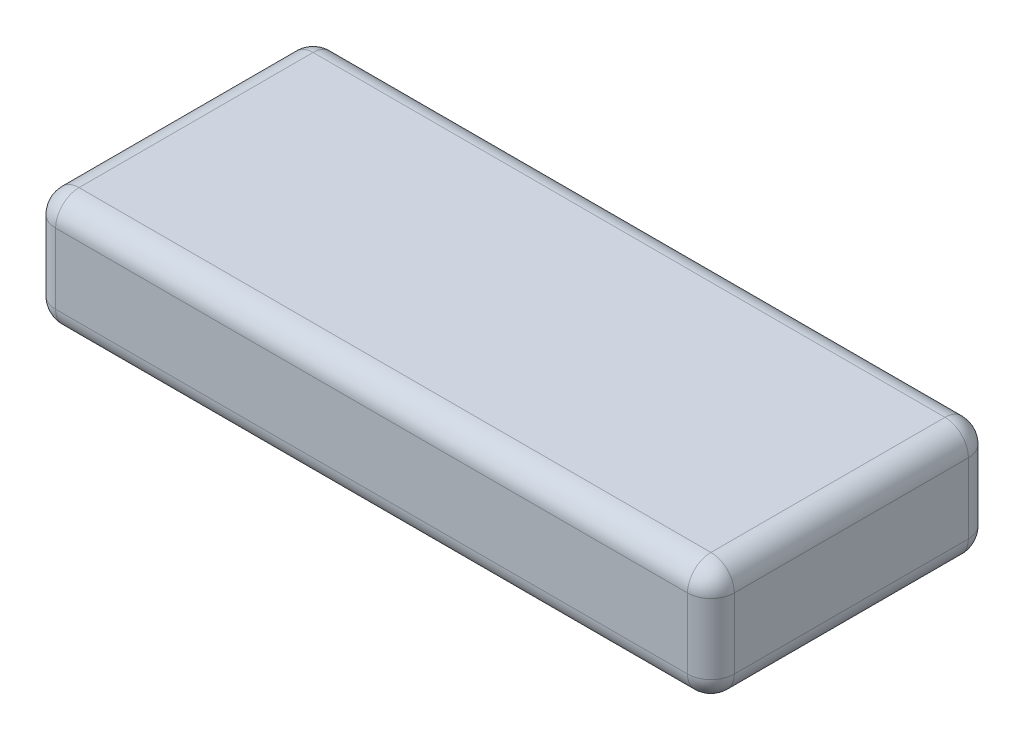
ISO-10303-21;
HEADER;
FILE_DESCRIPTION(('STEP AP214'),'2;1');
FILE_NAME('part.step','',(''),(''),'','','');
FILE_SCHEMA(('AUTOMOTIVE_DESIGN { 1 0 10303 214 1 1 1 1 }'));
ENDSEC;
DATA;
#1=APPLICATION_CONTEXT('core data for automotive mechanical design processes');
#2=APPLICATION_PROTOCOL_DEFINITION('international standard','automotive_design',2000,#1);
#3=PRODUCT_CONTEXT('',#1,'mechanical');
#4=PRODUCT('Part','Part','',(#3));
#5=PRODUCT_RELATED_PRODUCT_CATEGORY('part','',(#4));
#6=PRODUCT_DEFINITION_FORMATION('','',#4);
#7=PRODUCT_DEFINITION_CONTEXT('part definition',#1,'design');
#8=PRODUCT_DEFINITION('design','',#6,#7);
#9=PRODUCT_DEFINITION_SHAPE('','',#8);
#10=(LENGTH_UNIT() NAMED_UNIT(*) SI_UNIT(.MILLI.,.METRE.));
#11=(NAMED_UNIT(*) PLANE_ANGLE_UNIT() SI_UNIT($,.RADIAN.));
#12=(NAMED_UNIT(*) SI_UNIT($,.STERADIAN.) SOLID_ANGLE_UNIT());
#13=UNCERTAINTY_MEASURE_WITH_UNIT(LENGTH_MEASURE(1.E-05),#10,'distance_accuracy_value','');
#14=(GEOMETRIC_REPRESENTATION_CONTEXT(3) GLOBAL_UNCERTAINTY_ASSIGNED_CONTEXT((#13)) GLOBAL_UNIT_ASSIGNED_CONTEXT((#10,
#11,#12)) REPRESENTATION_CONTEXT('',''));
#15=CARTESIAN_POINT('',(0.,0.,0.));
#16=DIRECTION('',(0.,0.,1.));
#17=DIRECTION('',(1.,0.,0.));
#18=AXIS2_PLACEMENT_3D('',#15,#16,#17);
#19=CARTESIAN_POINT('',(14.5,5.,6.));
#20=DIRECTION('',(-1.,0.,0.));
#21=DIRECTION('',(0.,0.,1.));
#22=AXIS2_PLACEMENT_3D('',#19,#20,#21);
#23=PLANE('',#22);
#24=DIRECTION('',(0.,-1.,0.));
#25=VECTOR('',#24,1.);
#26=CARTESIAN_POINT('',(14.5,5.,5.));
#27=LINE('',#26,#25);
#28=CARTESIAN_POINT('',(14.5,4.,5.));
#29=VERTEX_POINT('',#28);
#30=CARTESIAN_POINT('',(14.5,1.,5.));
#31=VERTEX_POINT('',#30);
#32=EDGE_CURVE('E214',#29,#31,#27,.T.);
#33=ORIENTED_EDGE('',*,*,#32,.T.);
#34=DIRECTION('',(0.,0.,-1.));
#35=VECTOR('',#34,1.);
#36=CARTESIAN_POINT('',(14.5,1.,-6.));
#37=LINE('',#36,#35);
#38=CARTESIAN_POINT('',(14.5,1.,-5.));
#39=VERTEX_POINT('',#38);
#40=EDGE_CURVE('E218',#31,#39,#37,.T.);
#41=ORIENTED_EDGE('',*,*,#40,.T.);
#42=DIRECTION('',(0.,-1.,0.));
#43=VECTOR('',#42,1.);
#44=CARTESIAN_POINT('',(14.5,5.,-5.));
#45=LINE('',#44,#43);
#46=CARTESIAN_POINT('',(14.5,4.,-5.));
#47=VERTEX_POINT('',#46);
#48=EDGE_CURVE('E211',#39,#47,#45,.F.);
#49=ORIENTED_EDGE('',*,*,#48,.T.);
#50=DIRECTION('',(0.,0.,-1.));
#51=VECTOR('',#50,1.);
#52=CARTESIAN_POINT('',(14.5,4.,6.));
#53=LINE('',#52,#51);
#54=EDGE_CURVE('E208',#47,#29,#53,.F.);
#55=ORIENTED_EDGE('',*,*,#54,.T.);
#56=EDGE_LOOP('',(#33,#41,#49,#55));
#57=FACE_BOUND('',#56,.T.);
#58=ADVANCED_FACE('F45',(#57),#23,.F.);
#59=CARTESIAN_POINT('',(-14.5,5.,-6.));
#60=DIRECTION('',(0.,0.,1.));
#61=DIRECTION('',(1.,0.,0.));
#62=AXIS2_PLACEMENT_3D('',#59,#60,#61);
#63=PLANE('',#62);
#64=DIRECTION('',(0.,-1.,0.));
#65=VECTOR('',#64,1.);
#66=CARTESIAN_POINT('',(13.5,5.,-6.));
#67=LINE('',#66,#65);
#68=CARTESIAN_POINT('',(13.5,4.,-6.));
#69=VERTEX_POINT('',#68);
#70=CARTESIAN_POINT('',(13.5,1.,-6.));
#71=VERTEX_POINT('',#70);
#72=EDGE_CURVE('E187',#69,#71,#67,.T.);
#73=ORIENTED_EDGE('',*,*,#72,.T.);
#74=DIRECTION('',(-1.,0.,0.));
#75=VECTOR('',#74,1.);
#76=CARTESIAN_POINT('',(-14.5,1.,-6.));
#77=LINE('',#76,#75);
#78=CARTESIAN_POINT('',(-13.5,1.,-6.));
#79=VERTEX_POINT('',#78);
#80=EDGE_CURVE('E194',#71,#79,#77,.T.);
#81=ORIENTED_EDGE('',*,*,#80,.T.);
#82=DIRECTION('',(0.,-1.,0.));
#83=VECTOR('',#82,1.);
#84=CARTESIAN_POINT('',(-13.5,5.,-6.));
#85=LINE('',#84,#83);
#86=CARTESIAN_POINT('',(-13.5,4.,-6.));
#87=VERTEX_POINT('',#86);
#88=EDGE_CURVE('E190',#79,#87,#85,.F.);
#89=ORIENTED_EDGE('',*,*,#88,.T.);
#90=DIRECTION('',(-1.,0.,0.));
#91=VECTOR('',#90,1.);
#92=CARTESIAN_POINT('',(-14.5,4.,-6.));
#93=LINE('',#92,#91);
#94=EDGE_CURVE('E184',#87,#69,#93,.F.);
#95=ORIENTED_EDGE('',*,*,#94,.T.);
#96=EDGE_LOOP('',(#73,#81,#89,#95));
#97=FACE_BOUND('',#96,.T.);
#98=ADVANCED_FACE('F365',(#97),#63,.F.);
#99=CARTESIAN_POINT('',(-14.5,5.,6.));
#100=DIRECTION('',(1.,0.,0.));
#101=DIRECTION('',(0.,0.,-1.));
#102=AXIS2_PLACEMENT_3D('',#99,#100,#101);
#103=PLANE('',#102);
#104=DIRECTION('',(0.,-1.,0.));
#105=VECTOR('',#104,1.);
#106=CARTESIAN_POINT('',(-14.5,5.,-5.));
#107=LINE('',#106,#105);
#108=CARTESIAN_POINT('',(-14.5,4.,-5.));
#109=VERTEX_POINT('',#108);
#110=CARTESIAN_POINT('',(-14.5,1.,-5.));
#111=VERTEX_POINT('',#110);
#112=EDGE_CURVE('E146',#109,#111,#107,.T.);
#113=ORIENTED_EDGE('',*,*,#112,.T.);
#114=DIRECTION('',(0.,0.,1.));
#115=VECTOR('',#114,1.);
#116=CARTESIAN_POINT('',(-14.5,1.,6.));
#117=LINE('',#116,#115);
#118=CARTESIAN_POINT('',(-14.5,1.,5.));
#119=VERTEX_POINT('',#118);
#120=EDGE_CURVE('E141',#111,#119,#117,.T.);
#121=ORIENTED_EDGE('',*,*,#120,.T.);
#122=DIRECTION('',(0.,-1.,0.));
#123=VECTOR('',#122,1.);
#124=CARTESIAN_POINT('',(-14.5,5.,5.));
#125=LINE('',#124,#123);
#126=CARTESIAN_POINT('',(-14.5,4.,5.));
#127=VERTEX_POINT('',#126);
#128=EDGE_CURVE('E133',#119,#127,#125,.F.);
#129=ORIENTED_EDGE('',*,*,#128,.T.);
#130=DIRECTION('',(0.,0.,1.));
#131=VECTOR('',#130,1.);
#132=CARTESIAN_POINT('',(-14.5,4.,6.));
#133=LINE('',#132,#131);
#134=EDGE_CURVE('E138',#127,#109,#133,.F.);
#135=ORIENTED_EDGE('',*,*,#134,.T.);
#136=EDGE_LOOP('',(#113,#121,#129,#135));
#137=FACE_BOUND('',#136,.T.);
#138=ADVANCED_FACE('F136',(#137),#103,.F.);
#139=CARTESIAN_POINT('',(-14.5,5.,6.));
#140=DIRECTION('',(0.,0.,-1.));
#141=DIRECTION('',(-1.,0.,0.));
#142=AXIS2_PLACEMENT_3D('',#139,#140,#141);
#143=PLANE('',#142);
#144=DIRECTION('',(0.,-1.,0.));
#145=VECTOR('',#144,1.);
#146=CARTESIAN_POINT('',(-13.5,5.,6.));
#147=LINE('',#146,#145);
#148=CARTESIAN_POINT('',(-13.5,4.,6.));
#149=VERTEX_POINT('',#148);
#150=CARTESIAN_POINT('',(-13.5,1.,6.));
#151=VERTEX_POINT('',#150);
#152=EDGE_CURVE('E154',#149,#151,#147,.T.);
#153=ORIENTED_EDGE('',*,*,#152,.T.);
#154=DIRECTION('',(1.,0.,0.));
#155=VECTOR('',#154,1.);
#156=CARTESIAN_POINT('',(14.5,1.,6.));
#157=LINE('',#156,#155);
#158=CARTESIAN_POINT('',(13.5,1.,6.));
#159=VERTEX_POINT('',#158);
#160=EDGE_CURVE('E205',#151,#159,#157,.T.);
#161=ORIENTED_EDGE('',*,*,#160,.T.);
#162=DIRECTION('',(0.,-1.,0.));
#163=VECTOR('',#162,1.);
#164=CARTESIAN_POINT('',(13.5,5.,6.));
#165=LINE('',#164,#163);
#166=CARTESIAN_POINT('',(13.5,4.,6.));
#167=VERTEX_POINT('',#166);
#168=EDGE_CURVE('E200',#159,#167,#165,.F.);
#169=ORIENTED_EDGE('',*,*,#168,.T.);
#170=DIRECTION('',(1.,0.,0.));
#171=VECTOR('',#170,1.);
#172=CARTESIAN_POINT('',(-14.5,4.,6.));
#173=LINE('',#172,#171);
#174=EDGE_CURVE('E197',#167,#149,#173,.F.);
#175=ORIENTED_EDGE('',*,*,#174,.T.);
#176=EDGE_LOOP('',(#153,#161,#169,#175));
#177=FACE_BOUND('',#176,.T.);
#178=ADVANCED_FACE('F356',(#177),#143,.F.);
#179=CARTESIAN_POINT('',(0.,5.,0.));
#180=DIRECTION('',(0.,-1.,0.));
#181=DIRECTION('',(0.,0.,-1.));
#182=AXIS2_PLACEMENT_3D('',#179,#180,#181);
#183=PLANE('',#182);
#184=DIRECTION('',(0.,0.,1.));
#185=VECTOR('',#184,1.);
#186=CARTESIAN_POINT('',(-13.5,5.,0.));
#187=LINE('',#186,#185);
#188=CARTESIAN_POINT('',(-13.5,5.,-5.));
#189=VERTEX_POINT('',#188);
#190=CARTESIAN_POINT('',(-13.5,5.,5.));
#191=VERTEX_POINT('',#190);
#192=EDGE_CURVE('E55',#189,#191,#187,.T.);
#193=ORIENTED_EDGE('',*,*,#192,.T.);
#194=DIRECTION('',(1.,0.,0.));
#195=VECTOR('',#194,1.);
#196=CARTESIAN_POINT('',(0.,5.,5.));
#197=LINE('',#196,#195);
#198=CARTESIAN_POINT('',(13.5,5.,5.));
#199=VERTEX_POINT('',#198);
#200=EDGE_CURVE('E11',#191,#199,#197,.T.);
#201=ORIENTED_EDGE('',*,*,#200,.T.);
#202=DIRECTION('',(0.,0.,-1.));
#203=VECTOR('',#202,1.);
#204=CARTESIAN_POINT('',(13.5,5.,0.));
#205=LINE('',#204,#203);
#206=CARTESIAN_POINT('',(13.5,5.,-5.));
#207=VERTEX_POINT('',#206);
#208=EDGE_CURVE('E234',#199,#207,#205,.T.);
#209=ORIENTED_EDGE('',*,*,#208,.T.);
#210=DIRECTION('',(-1.,0.,0.));
#211=VECTOR('',#210,1.);
#212=CARTESIAN_POINT('',(0.,5.,-5.));
#213=LINE('',#212,#211);
#214=EDGE_CURVE('E66',#207,#189,#213,.T.);
#215=ORIENTED_EDGE('',*,*,#214,.T.);
#216=EDGE_LOOP('',(#193,#201,#209,#215));
#217=FACE_BOUND('',#216,.T.);
#218=ADVANCED_FACE('F358',(#217),#183,.F.);
#219=CARTESIAN_POINT('',(0.,0.,0.));
#220=DIRECTION('',(0.,-1.,0.));
#221=DIRECTION('',(0.,0.,-1.));
#222=AXIS2_PLACEMENT_3D('',#219,#220,#221);
#223=PLANE('',#222);
#224=DIRECTION('',(0.,0.,1.));
#225=VECTOR('',#224,1.);
#226=CARTESIAN_POINT('',(-13.5,0.,-6.));
#227=LINE('',#226,#225);
#228=CARTESIAN_POINT('',(-13.5,0.,5.));
#229=VERTEX_POINT('',#228);
#230=CARTESIAN_POINT('',(-13.5,0.,-5.));
#231=VERTEX_POINT('',#230);
#232=EDGE_CURVE('E227',#229,#231,#227,.F.);
#233=ORIENTED_EDGE('',*,*,#232,.T.);
#234=DIRECTION('',(-1.,0.,0.));
#235=VECTOR('',#234,1.);
#236=CARTESIAN_POINT('',(14.5,0.,-5.));
#237=LINE('',#236,#235);
#238=CARTESIAN_POINT('',(13.5,0.,-5.));
#239=VERTEX_POINT('',#238);
#240=EDGE_CURVE('E230',#231,#239,#237,.F.);
#241=ORIENTED_EDGE('',*,*,#240,.T.);
#242=DIRECTION('',(0.,0.,-1.));
#243=VECTOR('',#242,1.);
#244=CARTESIAN_POINT('',(13.5,0.,6.));
#245=LINE('',#244,#243);
#246=CARTESIAN_POINT('',(13.5,0.,5.));
#247=VERTEX_POINT('',#246);
#248=EDGE_CURVE('E221',#239,#247,#245,.F.);
#249=ORIENTED_EDGE('',*,*,#248,.T.);
#250=DIRECTION('',(1.,0.,0.));
#251=VECTOR('',#250,1.);
#252=CARTESIAN_POINT('',(-14.5,0.,5.));
#253=LINE('',#252,#251);
#254=EDGE_CURVE('E224',#247,#229,#253,.F.);
#255=ORIENTED_EDGE('',*,*,#254,.T.);
#256=EDGE_LOOP('',(#233,#241,#249,#255));
#257=FACE_BOUND('',#256,.T.);
#258=ADVANCED_FACE('F325',(#257),#223,.T.);
#259=CARTESIAN_POINT('',(13.5,5.,5.));
#260=DIRECTION('',(0.,-1.,0.));
#261=DIRECTION('',(0.,0.,-1.));
#262=AXIS2_PLACEMENT_3D('',#259,#260,#261);
#263=CYLINDRICAL_SURFACE('',#262,1.);
#264=CARTESIAN_POINT('',(13.5,4.,5.));
#265=DIRECTION('',(0.,1.,0.));
#266=DIRECTION('',(0.,0.,1.));
#267=AXIS2_PLACEMENT_3D('',#264,#265,#266);
#268=CIRCLE('',#267,1.);
#269=EDGE_CURVE('E49',#167,#29,#268,.T.);
#270=ORIENTED_EDGE('',*,*,#269,.F.);
#271=ORIENTED_EDGE('',*,*,#168,.F.);
#272=CARTESIAN_POINT('',(13.5,1.,5.));
#273=DIRECTION('',(0.,-1.,0.));
#274=DIRECTION('',(0.,0.,-1.));
#275=AXIS2_PLACEMENT_3D('',#272,#273,#274);
#276=CIRCLE('',#275,1.);
#277=EDGE_CURVE('E178',#31,#159,#276,.T.);
#278=ORIENTED_EDGE('',*,*,#277,.F.);
#279=ORIENTED_EDGE('',*,*,#32,.F.);
#280=EDGE_LOOP('',(#270,#271,#278,#279));
#281=FACE_BOUND('',#280,.T.);
#282=ADVANCED_FACE('F47',(#281),#263,.T.);
#283=CARTESIAN_POINT('',(13.5,4.,5.));
#284=DIRECTION('',(1.,0.,0.));
#285=DIRECTION('',(0.,0.,-1.));
#286=AXIS2_PLACEMENT_3D('',#283,#284,#285);
#287=SPHERICAL_SURFACE('',#286,1.);
#288=CARTESIAN_POINT('',(13.5,4.,5.));
#289=DIRECTION('',(1.,0.,0.));
#290=DIRECTION('',(0.,0.,-1.));
#291=AXIS2_PLACEMENT_3D('',#288,#289,#290);
#292=CIRCLE('',#291,1.);
#293=EDGE_CURVE('E301',#167,#199,#292,.F.);
#294=ORIENTED_EDGE('',*,*,#293,.F.);
#295=ORIENTED_EDGE('',*,*,#269,.T.);
#296=CARTESIAN_POINT('',(13.5,4.,5.));
#297=DIRECTION('',(0.,0.,1.));
#298=DIRECTION('',(1.,0.,0.));
#299=AXIS2_PLACEMENT_3D('',#296,#297,#298);
#300=CIRCLE('',#299,1.);
#301=EDGE_CURVE('E305',#199,#29,#300,.F.);
#302=ORIENTED_EDGE('',*,*,#301,.F.);
#303=EDGE_LOOP('',(#294,#295,#302));
#304=FACE_BOUND('',#303,.T.);
#305=ADVANCED_FACE('F351',(#304),#287,.T.);
#306=CARTESIAN_POINT('',(13.5,1.,5.));
#307=DIRECTION('',(0.,0.,1.));
#308=DIRECTION('',(1.,0.,0.));
#309=AXIS2_PLACEMENT_3D('',#306,#307,#308);
#310=SPHERICAL_SURFACE('',#309,1.);
#311=CARTESIAN_POINT('',(13.5,1.,5.));
#312=DIRECTION('',(0.,0.,1.));
#313=DIRECTION('',(1.,0.,0.));
#314=AXIS2_PLACEMENT_3D('',#311,#312,#313);
#315=CIRCLE('',#314,1.);
#316=EDGE_CURVE('E293',#31,#247,#315,.F.);
#317=ORIENTED_EDGE('',*,*,#316,.F.);
#318=ORIENTED_EDGE('',*,*,#277,.T.);
#319=CARTESIAN_POINT('',(13.5,1.,5.));
#320=DIRECTION('',(1.,0.,0.));
#321=DIRECTION('',(0.,0.,-1.));
#322=AXIS2_PLACEMENT_3D('',#319,#320,#321);
#323=CIRCLE('',#322,1.);
#324=EDGE_CURVE('E297',#247,#159,#323,.F.);
#325=ORIENTED_EDGE('',*,*,#324,.F.);
#326=EDGE_LOOP('',(#317,#318,#325));
#327=FACE_BOUND('',#326,.T.);
#328=ADVANCED_FACE('F314',(#327),#310,.T.);
#329=CARTESIAN_POINT('',(13.5,4.,0.));
#330=DIRECTION('',(0.,0.,-1.));
#331=DIRECTION('',(-1.,0.,0.));
#332=AXIS2_PLACEMENT_3D('',#329,#330,#331);
#333=CYLINDRICAL_SURFACE('',#332,1.);
#334=ORIENTED_EDGE('',*,*,#301,.T.);
#335=ORIENTED_EDGE('',*,*,#54,.F.);
#336=CARTESIAN_POINT('',(13.5,4.,-5.));
#337=DIRECTION('',(0.,0.,-1.));
#338=DIRECTION('',(-1.,0.,0.));
#339=AXIS2_PLACEMENT_3D('',#336,#337,#338);
#340=CIRCLE('',#339,1.);
#341=EDGE_CURVE('E285',#207,#47,#340,.T.);
#342=ORIENTED_EDGE('',*,*,#341,.F.);
#343=ORIENTED_EDGE('',*,*,#208,.F.);
#344=EDGE_LOOP('',(#334,#335,#342,#343));
#345=FACE_BOUND('',#344,.T.);
#346=ADVANCED_FACE('F346',(#345),#333,.T.);
#347=CARTESIAN_POINT('',(0.,4.,5.));
#348=DIRECTION('',(1.,0.,0.));
#349=DIRECTION('',(0.,0.,-1.));
#350=AXIS2_PLACEMENT_3D('',#347,#348,#349);
#351=CYLINDRICAL_SURFACE('',#350,1.);
#352=ORIENTED_EDGE('',*,*,#293,.T.);
#353=ORIENTED_EDGE('',*,*,#200,.F.);
#354=CARTESIAN_POINT('',(-13.5,4.,5.));
#355=DIRECTION('',(-1.,0.,0.));
#356=DIRECTION('',(0.,0.,1.));
#357=AXIS2_PLACEMENT_3D('',#354,#355,#356);
#358=CIRCLE('',#357,1.);
#359=EDGE_CURVE('E159',#149,#191,#358,.T.);
#360=ORIENTED_EDGE('',*,*,#359,.F.);
#361=ORIENTED_EDGE('',*,*,#174,.F.);
#362=EDGE_LOOP('',(#352,#353,#360,#361));
#363=FACE_BOUND('',#362,.T.);
#364=ADVANCED_FACE('F354',(#363),#351,.T.);
#365=CARTESIAN_POINT('',(-13.5,5.,5.));
#366=DIRECTION('',(0.,-1.,0.));
#367=DIRECTION('',(0.,0.,-1.));
#368=AXIS2_PLACEMENT_3D('',#365,#366,#367);
#369=CYLINDRICAL_SURFACE('',#368,1.);
#370=CARTESIAN_POINT('',(-13.5,1.,5.));
#371=DIRECTION('',(0.,-1.,0.));
#372=DIRECTION('',(0.,0.,-1.));
#373=AXIS2_PLACEMENT_3D('',#370,#371,#372);
#374=CIRCLE('',#373,1.);
#375=EDGE_CURVE('E160',#151,#119,#374,.T.);
#376=ORIENTED_EDGE('',*,*,#375,.F.);
#377=ORIENTED_EDGE('',*,*,#152,.F.);
#378=CARTESIAN_POINT('',(-13.5,4.,5.));
#379=DIRECTION('',(0.,1.,0.));
#380=DIRECTION('',(0.,0.,1.));
#381=AXIS2_PLACEMENT_3D('',#378,#379,#380);
#382=CIRCLE('',#381,1.);
#383=EDGE_CURVE('E150',#127,#149,#382,.T.);
#384=ORIENTED_EDGE('',*,*,#383,.F.);
#385=ORIENTED_EDGE('',*,*,#128,.F.);
#386=EDGE_LOOP('',(#376,#377,#384,#385));
#387=FACE_BOUND('',#386,.T.);
#388=ADVANCED_FACE('F152',(#387),#369,.T.);
#389=CARTESIAN_POINT('',(-14.5,1.,5.));
#390=DIRECTION('',(-1.,0.,0.));
#391=DIRECTION('',(0.,0.,1.));
#392=AXIS2_PLACEMENT_3D('',#389,#390,#391);
#393=CYLINDRICAL_SURFACE('',#392,1.);
#394=ORIENTED_EDGE('',*,*,#324,.T.);
#395=ORIENTED_EDGE('',*,*,#160,.F.);
#396=CARTESIAN_POINT('',(-13.5,1.,5.));
#397=DIRECTION('',(-1.,0.,0.));
#398=DIRECTION('',(0.,0.,1.));
#399=AXIS2_PLACEMENT_3D('',#396,#397,#398);
#400=CIRCLE('',#399,1.);
#401=EDGE_CURVE('E278',#229,#151,#400,.T.);
#402=ORIENTED_EDGE('',*,*,#401,.F.);
#403=ORIENTED_EDGE('',*,*,#254,.F.);
#404=EDGE_LOOP('',(#394,#395,#402,#403));
#405=FACE_BOUND('',#404,.T.);
#406=ADVANCED_FACE('F321',(#405),#393,.T.);
#407=CARTESIAN_POINT('',(13.5,1.,6.));
#408=DIRECTION('',(0.,0.,1.));
#409=DIRECTION('',(1.,0.,0.));
#410=AXIS2_PLACEMENT_3D('',#407,#408,#409);
#411=CYLINDRICAL_SURFACE('',#410,1.);
#412=ORIENTED_EDGE('',*,*,#316,.T.);
#413=ORIENTED_EDGE('',*,*,#248,.F.);
#414=CARTESIAN_POINT('',(13.5,1.,-5.));
#415=DIRECTION('',(0.,0.,-1.));
#416=DIRECTION('',(-1.,0.,0.));
#417=AXIS2_PLACEMENT_3D('',#414,#415,#416);
#418=CIRCLE('',#417,1.);
#419=EDGE_CURVE('E274',#39,#239,#418,.T.);
#420=ORIENTED_EDGE('',*,*,#419,.F.);
#421=ORIENTED_EDGE('',*,*,#40,.F.);
#422=EDGE_LOOP('',(#412,#413,#420,#421));
#423=FACE_BOUND('',#422,.T.);
#424=ADVANCED_FACE('F331',(#423),#411,.T.);
#425=CARTESIAN_POINT('',(13.5,5.,-5.));
#426=DIRECTION('',(0.,-1.,0.));
#427=DIRECTION('',(0.,0.,-1.));
#428=AXIS2_PLACEMENT_3D('',#425,#426,#427);
#429=CYLINDRICAL_SURFACE('',#428,1.);
#430=CARTESIAN_POINT('',(13.5,4.,-5.));
#431=DIRECTION('',(0.,1.,0.));
#432=DIRECTION('',(0.,0.,1.));
#433=AXIS2_PLACEMENT_3D('',#430,#431,#432);
#434=CIRCLE('',#433,1.);
#435=EDGE_CURVE('E289',#47,#69,#434,.T.);
#436=ORIENTED_EDGE('',*,*,#435,.F.);
#437=ORIENTED_EDGE('',*,*,#48,.F.);
#438=CARTESIAN_POINT('',(13.5,1.,-5.));
#439=DIRECTION('',(0.,-1.,0.));
#440=DIRECTION('',(0.,0.,-1.));
#441=AXIS2_PLACEMENT_3D('',#438,#439,#440);
#442=CIRCLE('',#441,1.);
#443=EDGE_CURVE('E270',#71,#39,#442,.T.);
#444=ORIENTED_EDGE('',*,*,#443,.F.);
#445=ORIENTED_EDGE('',*,*,#72,.F.);
#446=EDGE_LOOP('',(#436,#437,#444,#445));
#447=FACE_BOUND('',#446,.T.);
#448=ADVANCED_FACE('F338',(#447),#429,.T.);
#449=CARTESIAN_POINT('',(13.5,4.,-5.));
#450=DIRECTION('',(1.,0.,0.));
#451=DIRECTION('',(0.,0.,-1.));
#452=AXIS2_PLACEMENT_3D('',#449,#450,#451);
#453=SPHERICAL_SURFACE('',#452,1.);
#454=ORIENTED_EDGE('',*,*,#341,.T.);
#455=ORIENTED_EDGE('',*,*,#435,.T.);
#456=CARTESIAN_POINT('',(13.5,4.,-5.));
#457=DIRECTION('',(1.,0.,0.));
#458=DIRECTION('',(0.,1.,0.));
#459=AXIS2_PLACEMENT_3D('',#456,#457,#458);
#460=CIRCLE('',#459,1.);
#461=EDGE_CURVE('E167',#207,#69,#460,.F.);
#462=ORIENTED_EDGE('',*,*,#461,.F.);
#463=EDGE_LOOP('',(#454,#455,#462));
#464=FACE_BOUND('',#463,.T.);
#465=ADVANCED_FACE('F344',(#464),#453,.T.);
#466=CARTESIAN_POINT('',(-13.5,4.,5.));
#467=DIRECTION('',(0.,0.,1.));
#468=DIRECTION('',(1.,0.,0.));
#469=AXIS2_PLACEMENT_3D('',#466,#467,#468);
#470=SPHERICAL_SURFACE('',#469,1.);
#471=ORIENTED_EDGE('',*,*,#383,.T.);
#472=ORIENTED_EDGE('',*,*,#359,.T.);
#473=CARTESIAN_POINT('',(-13.5,4.,5.));
#474=DIRECTION('',(0.,0.,1.));
#475=DIRECTION('',(1.,0.,0.));
#476=AXIS2_PLACEMENT_3D('',#473,#474,#475);
#477=CIRCLE('',#476,1.);
#478=EDGE_CURVE('E163',#127,#191,#477,.F.);
#479=ORIENTED_EDGE('',*,*,#478,.F.);
#480=EDGE_LOOP('',(#471,#472,#479));
#481=FACE_BOUND('',#480,.T.);
#482=ADVANCED_FACE('F164',(#481),#470,.T.);
#483=CARTESIAN_POINT('',(-13.5,1.,5.));
#484=DIRECTION('',(0.,0.,1.));
#485=DIRECTION('',(1.,0.,0.));
#486=AXIS2_PLACEMENT_3D('',#483,#484,#485);
#487=SPHERICAL_SURFACE('',#486,1.);
#488=ORIENTED_EDGE('',*,*,#401,.T.);
#489=ORIENTED_EDGE('',*,*,#375,.T.);
#490=CARTESIAN_POINT('',(-13.5,1.,5.));
#491=DIRECTION('',(0.,0.,1.));
#492=DIRECTION('',(1.,0.,0.));
#493=AXIS2_PLACEMENT_3D('',#490,#491,#492);
#494=CIRCLE('',#493,1.);
#495=EDGE_CURVE('E168',#229,#119,#494,.F.);
#496=ORIENTED_EDGE('',*,*,#495,.F.);
#497=EDGE_LOOP('',(#488,#489,#496));
#498=FACE_BOUND('',#497,.T.);
#499=ADVANCED_FACE('F405',(#498),#487,.T.);
#500=CARTESIAN_POINT('',(13.5,1.,-5.));
#501=DIRECTION('',(1.,0.,0.));
#502=DIRECTION('',(0.,0.,-1.));
#503=AXIS2_PLACEMENT_3D('',#500,#501,#502);
#504=SPHERICAL_SURFACE('',#503,1.);
#505=ORIENTED_EDGE('',*,*,#443,.T.);
#506=ORIENTED_EDGE('',*,*,#419,.T.);
#507=CARTESIAN_POINT('',(13.5,1.,-5.));
#508=DIRECTION('',(1.,0.,0.));
#509=DIRECTION('',(0.,0.,-1.));
#510=AXIS2_PLACEMENT_3D('',#507,#508,#509);
#511=CIRCLE('',#510,1.);
#512=EDGE_CURVE('E261',#71,#239,#511,.F.);
#513=ORIENTED_EDGE('',*,*,#512,.F.);
#514=EDGE_LOOP('',(#505,#506,#513));
#515=FACE_BOUND('',#514,.T.);
#516=ADVANCED_FACE('F401',(#515),#504,.T.);
#517=CARTESIAN_POINT('',(0.,4.,-5.));
#518=DIRECTION('',(-1.,0.,0.));
#519=DIRECTION('',(0.,0.,1.));
#520=AXIS2_PLACEMENT_3D('',#517,#518,#519);
#521=CYLINDRICAL_SURFACE('',#520,1.);
#522=ORIENTED_EDGE('',*,*,#461,.T.);
#523=ORIENTED_EDGE('',*,*,#94,.F.);
#524=CARTESIAN_POINT('',(-13.5,4.,-5.));
#525=DIRECTION('',(-1.,0.,0.));
#526=DIRECTION('',(0.,0.,1.));
#527=AXIS2_PLACEMENT_3D('',#524,#525,#526);
#528=CIRCLE('',#527,1.);
#529=EDGE_CURVE('E257',#189,#87,#528,.T.);
#530=ORIENTED_EDGE('',*,*,#529,.F.);
#531=ORIENTED_EDGE('',*,*,#214,.F.);
#532=EDGE_LOOP('',(#522,#523,#530,#531));
#533=FACE_BOUND('',#532,.T.);
#534=ADVANCED_FACE('F398',(#533),#521,.T.);
#535=CARTESIAN_POINT('',(-13.5,4.,0.));
#536=DIRECTION('',(0.,0.,1.));
#537=DIRECTION('',(1.,0.,0.));
#538=AXIS2_PLACEMENT_3D('',#535,#536,#537);
#539=CYLINDRICAL_SURFACE('',#538,1.);
#540=ORIENTED_EDGE('',*,*,#478,.T.);
#541=ORIENTED_EDGE('',*,*,#192,.F.);
#542=CARTESIAN_POINT('',(-13.5,4.,-5.));
#543=DIRECTION('',(0.,0.,-1.));
#544=DIRECTION('',(0.,1.,0.));
#545=AXIS2_PLACEMENT_3D('',#542,#543,#544);
#546=CIRCLE('',#545,1.);
#547=EDGE_CURVE('E172',#109,#189,#546,.T.);
#548=ORIENTED_EDGE('',*,*,#547,.F.);
#549=ORIENTED_EDGE('',*,*,#134,.F.);
#550=EDGE_LOOP('',(#540,#541,#548,#549));
#551=FACE_BOUND('',#550,.T.);
#552=ADVANCED_FACE('F170',(#551),#539,.T.);
#553=CARTESIAN_POINT('',(-13.5,1.,6.));
#554=DIRECTION('',(0.,0.,-1.));
#555=DIRECTION('',(-1.,0.,0.));
#556=AXIS2_PLACEMENT_3D('',#553,#554,#555);
#557=CYLINDRICAL_SURFACE('',#556,1.);
#558=ORIENTED_EDGE('',*,*,#495,.T.);
#559=ORIENTED_EDGE('',*,*,#120,.F.);
#560=CARTESIAN_POINT('',(-13.5,1.,-5.));
#561=DIRECTION('',(0.,0.,-1.));
#562=DIRECTION('',(-1.,0.,0.));
#563=AXIS2_PLACEMENT_3D('',#560,#561,#562);
#564=CIRCLE('',#563,1.);
#565=EDGE_CURVE('E251',#231,#111,#564,.T.);
#566=ORIENTED_EDGE('',*,*,#565,.F.);
#567=ORIENTED_EDGE('',*,*,#232,.F.);
#568=EDGE_LOOP('',(#558,#559,#566,#567));
#569=FACE_BOUND('',#568,.T.);
#570=ADVANCED_FACE('F391',(#569),#557,.T.);
#571=CARTESIAN_POINT('',(-14.5,1.,-5.));
#572=DIRECTION('',(1.,0.,0.));
#573=DIRECTION('',(0.,0.,-1.));
#574=AXIS2_PLACEMENT_3D('',#571,#572,#573);
#575=CYLINDRICAL_SURFACE('',#574,1.);
#576=ORIENTED_EDGE('',*,*,#512,.T.);
#577=ORIENTED_EDGE('',*,*,#240,.F.);
#578=CARTESIAN_POINT('',(-13.5,1.,-5.));
#579=DIRECTION('',(-1.,0.,0.));
#580=DIRECTION('',(0.,0.,1.));
#581=AXIS2_PLACEMENT_3D('',#578,#579,#580);
#582=CIRCLE('',#581,1.);
#583=EDGE_CURVE('E247',#79,#231,#582,.T.);
#584=ORIENTED_EDGE('',*,*,#583,.F.);
#585=ORIENTED_EDGE('',*,*,#80,.F.);
#586=EDGE_LOOP('',(#576,#577,#584,#585));
#587=FACE_BOUND('',#586,.T.);
#588=ADVANCED_FACE('F387',(#587),#575,.T.);
#589=CARTESIAN_POINT('',(-13.5,4.,-5.));
#590=DIRECTION('',(0.,1.,0.));
#591=DIRECTION('',(0.,0.,1.));
#592=AXIS2_PLACEMENT_3D('',#589,#590,#591);
#593=SPHERICAL_SURFACE('',#592,1.);
#594=ORIENTED_EDGE('',*,*,#547,.T.);
#595=ORIENTED_EDGE('',*,*,#529,.T.);
#596=CARTESIAN_POINT('',(-13.5,4.,-5.));
#597=DIRECTION('',(0.,1.,0.));
#598=DIRECTION('',(0.,0.,1.));
#599=AXIS2_PLACEMENT_3D('',#596,#597,#598);
#600=CIRCLE('',#599,1.);
#601=EDGE_CURVE('E244',#109,#87,#600,.F.);
#602=ORIENTED_EDGE('',*,*,#601,.F.);
#603=EDGE_LOOP('',(#594,#595,#602));
#604=FACE_BOUND('',#603,.T.);
#605=ADVANCED_FACE('F383',(#604),#593,.T.);
#606=CARTESIAN_POINT('',(-13.5,1.,-5.));
#607=DIRECTION('',(0.,-1.,0.));
#608=DIRECTION('',(0.,0.,-1.));
#609=AXIS2_PLACEMENT_3D('',#606,#607,#608);
#610=SPHERICAL_SURFACE('',#609,1.);
#611=ORIENTED_EDGE('',*,*,#583,.T.);
#612=ORIENTED_EDGE('',*,*,#565,.T.);
#613=CARTESIAN_POINT('',(-13.5,1.,-5.));
#614=DIRECTION('',(0.,-1.,0.));
#615=DIRECTION('',(0.,0.,-1.));
#616=AXIS2_PLACEMENT_3D('',#613,#614,#615);
#617=CIRCLE('',#616,1.);
#618=EDGE_CURVE('E241',#79,#111,#617,.F.);
#619=ORIENTED_EDGE('',*,*,#618,.F.);
#620=EDGE_LOOP('',(#611,#612,#619));
#621=FACE_BOUND('',#620,.T.);
#622=ADVANCED_FACE('F379',(#621),#610,.T.);
#623=CARTESIAN_POINT('',(-13.5,5.,-5.));
#624=DIRECTION('',(0.,-1.,0.));
#625=DIRECTION('',(0.,0.,-1.));
#626=AXIS2_PLACEMENT_3D('',#623,#624,#625);
#627=CYLINDRICAL_SURFACE('',#626,1.);
#628=ORIENTED_EDGE('',*,*,#601,.T.);
#629=ORIENTED_EDGE('',*,*,#88,.F.);
#630=ORIENTED_EDGE('',*,*,#618,.T.);
#631=ORIENTED_EDGE('',*,*,#112,.F.);
#632=EDGE_LOOP('',(#628,#629,#630,#631));
#633=FACE_BOUND('',#632,.T.);
#634=ADVANCED_FACE('F376',(#633),#627,.T.);
#635=CLOSED_SHELL('',(#58,#98,#138,#178,#218,#258,#282,#305,#328,#346,#364,#388,#406,#424,#448,
#465,#482,#499,#516,#534,#552,#570,#588,#605,#622,#634));
#636=MANIFOLD_SOLID_BREP('B2',#635);
#637=ADVANCED_BREP_SHAPE_REPRESENTATION('',(#18,#636),#14);
#638=SHAPE_DEFINITION_REPRESENTATION(#9,#637);
ENDSEC;
END-ISO-10303-21;
